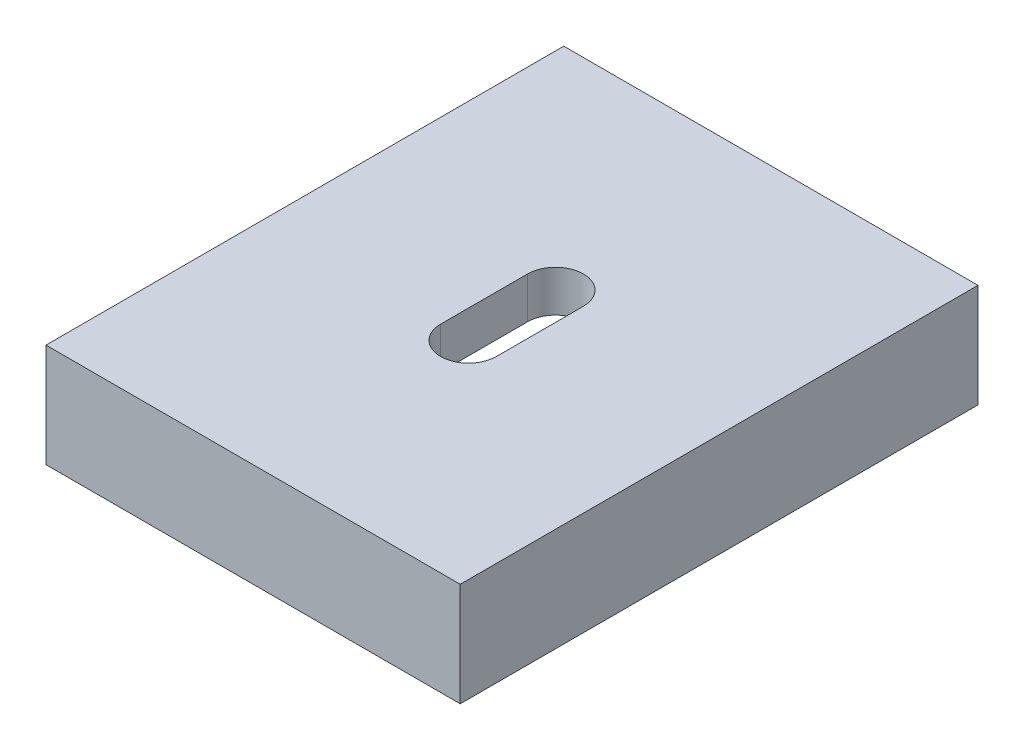
ISO-10303-21;
HEADER;
FILE_DESCRIPTION(('STEP AP214'),'2;1');
FILE_NAME('part.step','',(''),(''),'','','');
FILE_SCHEMA(('AUTOMOTIVE_DESIGN { 1 0 10303 214 1 1 1 1 }'));
ENDSEC;
DATA;
#1=APPLICATION_CONTEXT('core data for automotive mechanical design processes');
#2=APPLICATION_PROTOCOL_DEFINITION('international standard','automotive_design',2000,#1);
#3=PRODUCT_CONTEXT('',#1,'mechanical');
#4=PRODUCT('Part','Part','',(#3));
#5=PRODUCT_RELATED_PRODUCT_CATEGORY('part','',(#4));
#6=PRODUCT_DEFINITION_FORMATION('','',#4);
#7=PRODUCT_DEFINITION_CONTEXT('part definition',#1,'design');
#8=PRODUCT_DEFINITION('design','',#6,#7);
#9=PRODUCT_DEFINITION_SHAPE('','',#8);
#10=(LENGTH_UNIT() NAMED_UNIT(*) SI_UNIT(.MILLI.,.METRE.));
#11=(NAMED_UNIT(*) PLANE_ANGLE_UNIT() SI_UNIT($,.RADIAN.));
#12=(NAMED_UNIT(*) SI_UNIT($,.STERADIAN.) SOLID_ANGLE_UNIT());
#13=UNCERTAINTY_MEASURE_WITH_UNIT(LENGTH_MEASURE(1.E-05),#10,'distance_accuracy_value','');
#14=(GEOMETRIC_REPRESENTATION_CONTEXT(3) GLOBAL_UNCERTAINTY_ASSIGNED_CONTEXT((#13)) GLOBAL_UNIT_ASSIGNED_CONTEXT((#10,
#11,#12)) REPRESENTATION_CONTEXT('',''));
#15=CARTESIAN_POINT('',(0.,0.,0.));
#16=DIRECTION('',(0.,0.,1.));
#17=DIRECTION('',(1.,0.,0.));
#18=AXIS2_PLACEMENT_3D('',#15,#16,#17);
#19=CARTESIAN_POINT('',(0.,10.,0.));
#20=DIRECTION('',(0.,1.,0.));
#21=DIRECTION('',(0.,0.,1.));
#22=AXIS2_PLACEMENT_3D('',#19,#20,#21);
#23=PLANE('',#22);
#24=DIRECTION('',(1.,0.,0.));
#25=VECTOR('',#24,1.);
#26=CARTESIAN_POINT('',(-20.,10.,25.));
#27=LINE('',#26,#25);
#28=CARTESIAN_POINT('',(-20.,10.,25.));
#29=VERTEX_POINT('',#28);
#30=CARTESIAN_POINT('',(20.,10.,25.));
#31=VERTEX_POINT('',#30);
#32=EDGE_CURVE('E192',#29,#31,#27,.T.);
#33=ORIENTED_EDGE('',*,*,#32,.T.);
#34=DIRECTION('',(0.,0.,-1.));
#35=VECTOR('',#34,1.);
#36=CARTESIAN_POINT('',(20.,10.,25.));
#37=LINE('',#36,#35);
#38=CARTESIAN_POINT('',(20.,10.,-25.));
#39=VERTEX_POINT('',#38);
#40=EDGE_CURVE('E195',#31,#39,#37,.T.);
#41=ORIENTED_EDGE('',*,*,#40,.T.);
#42=DIRECTION('',(-1.,0.,0.));
#43=VECTOR('',#42,1.);
#44=CARTESIAN_POINT('',(-20.,10.,-25.));
#45=LINE('',#44,#43);
#46=CARTESIAN_POINT('',(-20.,10.,-25.));
#47=VERTEX_POINT('',#46);
#48=EDGE_CURVE('E198',#39,#47,#45,.T.);
#49=ORIENTED_EDGE('',*,*,#48,.T.);
#50=DIRECTION('',(0.,0.,1.));
#51=VECTOR('',#50,1.);
#52=CARTESIAN_POINT('',(-20.,10.,25.));
#53=LINE('',#52,#51);
#54=EDGE_CURVE('E200',#47,#29,#53,.T.);
#55=ORIENTED_EDGE('',*,*,#54,.T.);
#56=EDGE_LOOP('',(#33,#41,#49,#55));
#57=FACE_BOUND('',#56,.T.);
#58=DIRECTION('',(0.,0.,1.));
#59=VECTOR('',#58,1.);
#60=CARTESIAN_POINT('',(-2.7,10.,0.));
#61=LINE('',#60,#59);
#62=CARTESIAN_POINT('',(-2.7,10.,-4.2));
#63=VERTEX_POINT('',#62);
#64=CARTESIAN_POINT('',(-2.7,10.,4.2));
#65=VERTEX_POINT('',#64);
#66=EDGE_CURVE('E136',#63,#65,#61,.T.);
#67=ORIENTED_EDGE('',*,*,#66,.F.);
#68=CARTESIAN_POINT('',(0.,10.,-4.2));
#69=DIRECTION('',(0.,-1.,0.));
#70=DIRECTION('',(1.,0.,0.));
#71=AXIS2_PLACEMENT_3D('',#68,#69,#70);
#72=CIRCLE('',#71,2.7);
#73=CARTESIAN_POINT('',(2.7,10.,-4.2));
#74=VERTEX_POINT('',#73);
#75=EDGE_CURVE('E128',#74,#63,#72,.F.);
#76=ORIENTED_EDGE('',*,*,#75,.F.);
#77=DIRECTION('',(0.,0.,1.));
#78=VECTOR('',#77,1.);
#79=CARTESIAN_POINT('',(2.7,10.,0.));
#80=LINE('',#79,#78);
#81=CARTESIAN_POINT('',(2.7,10.,4.2));
#82=VERTEX_POINT('',#81);
#83=EDGE_CURVE('E139',#74,#82,#80,.T.);
#84=ORIENTED_EDGE('',*,*,#83,.T.);
#85=CARTESIAN_POINT('',(0.,10.,4.2));
#86=DIRECTION('',(0.,-1.,0.));
#87=DIRECTION('',(1.,0.,0.));
#88=AXIS2_PLACEMENT_3D('',#85,#86,#87);
#89=CIRCLE('',#88,2.7);
#90=EDGE_CURVE('E55',#82,#65,#89,.T.);
#91=ORIENTED_EDGE('',*,*,#90,.T.);
#92=EDGE_LOOP('',(#67,#76,#84,#91));
#93=FACE_BOUND('',#92,.T.);
#94=ADVANCED_FACE('F35',(#57,#93),#23,.T.);
#95=CARTESIAN_POINT('',(0.,0.,0.));
#96=DIRECTION('',(0.,1.,0.));
#97=DIRECTION('',(0.,0.,1.));
#98=AXIS2_PLACEMENT_3D('',#95,#96,#97);
#99=PLANE('',#98);
#100=DIRECTION('',(1.,0.,0.));
#101=VECTOR('',#100,1.);
#102=CARTESIAN_POINT('',(-20.,0.,25.));
#103=LINE('',#102,#101);
#104=CARTESIAN_POINT('',(-20.,0.,25.));
#105=VERTEX_POINT('',#104);
#106=CARTESIAN_POINT('',(20.,0.,25.));
#107=VERTEX_POINT('',#106);
#108=EDGE_CURVE('E191',#105,#107,#103,.T.);
#109=ORIENTED_EDGE('',*,*,#108,.F.);
#110=DIRECTION('',(0.,0.,1.));
#111=VECTOR('',#110,1.);
#112=CARTESIAN_POINT('',(-20.,0.,25.));
#113=LINE('',#112,#111);
#114=CARTESIAN_POINT('',(-20.,0.,-25.));
#115=VERTEX_POINT('',#114);
#116=EDGE_CURVE('E196',#115,#105,#113,.T.);
#117=ORIENTED_EDGE('',*,*,#116,.F.);
#118=DIRECTION('',(-1.,0.,0.));
#119=VECTOR('',#118,1.);
#120=CARTESIAN_POINT('',(-20.,0.,-25.));
#121=LINE('',#120,#119);
#122=CARTESIAN_POINT('',(20.,0.,-25.));
#123=VERTEX_POINT('',#122);
#124=EDGE_CURVE('E207',#123,#115,#121,.T.);
#125=ORIENTED_EDGE('',*,*,#124,.F.);
#126=DIRECTION('',(0.,0.,-1.));
#127=VECTOR('',#126,1.);
#128=CARTESIAN_POINT('',(20.,0.,25.));
#129=LINE('',#128,#127);
#130=EDGE_CURVE('E205',#107,#123,#129,.T.);
#131=ORIENTED_EDGE('',*,*,#130,.F.);
#132=EDGE_LOOP('',(#109,#117,#125,#131));
#133=FACE_BOUND('',#132,.T.);
#134=DIRECTION('',(0.,0.,-1.));
#135=VECTOR('',#134,1.);
#136=CARTESIAN_POINT('',(13.,0.,0.));
#137=LINE('',#136,#135);
#138=CARTESIAN_POINT('',(13.,0.,20.5));
#139=VERTEX_POINT('',#138);
#140=CARTESIAN_POINT('',(13.,0.,-20.5));
#141=VERTEX_POINT('',#140);
#142=EDGE_CURVE('E157',#139,#141,#137,.T.);
#143=ORIENTED_EDGE('',*,*,#142,.T.);
#144=DIRECTION('',(-1.,0.,0.));
#145=VECTOR('',#144,1.);
#146=CARTESIAN_POINT('',(0.,0.,-20.5));
#147=LINE('',#146,#145);
#148=CARTESIAN_POINT('',(-13.,0.,-20.5));
#149=VERTEX_POINT('',#148);
#150=EDGE_CURVE('E174',#141,#149,#147,.T.);
#151=ORIENTED_EDGE('',*,*,#150,.T.);
#152=DIRECTION('',(0.,0.,1.));
#153=VECTOR('',#152,1.);
#154=CARTESIAN_POINT('',(-13.,0.,0.));
#155=LINE('',#154,#153);
#156=CARTESIAN_POINT('',(-13.,0.,20.5));
#157=VERTEX_POINT('',#156);
#158=EDGE_CURVE('E177',#149,#157,#155,.T.);
#159=ORIENTED_EDGE('',*,*,#158,.T.);
#160=DIRECTION('',(1.,0.,0.));
#161=VECTOR('',#160,1.);
#162=CARTESIAN_POINT('',(0.,0.,20.5));
#163=LINE('',#162,#161);
#164=EDGE_CURVE('E165',#157,#139,#163,.T.);
#165=ORIENTED_EDGE('',*,*,#164,.T.);
#166=EDGE_LOOP('',(#143,#151,#159,#165));
#167=FACE_BOUND('',#166,.T.);
#168=ADVANCED_FACE('F225',(#133,#167),#99,.F.);
#169=CARTESIAN_POINT('',(-20.,10.,25.));
#170=DIRECTION('',(0.,0.,-1.));
#171=DIRECTION('',(-1.,0.,0.));
#172=AXIS2_PLACEMENT_3D('',#169,#170,#171);
#173=PLANE('',#172);
#174=ORIENTED_EDGE('',*,*,#108,.T.);
#175=DIRECTION('',(0.,-1.,0.));
#176=VECTOR('',#175,1.);
#177=CARTESIAN_POINT('',(20.,10.,25.));
#178=LINE('',#177,#176);
#179=EDGE_CURVE('E11',#31,#107,#178,.T.);
#180=ORIENTED_EDGE('',*,*,#179,.F.);
#181=ORIENTED_EDGE('',*,*,#32,.F.);
#182=DIRECTION('',(0.,-1.,0.));
#183=VECTOR('',#182,1.);
#184=CARTESIAN_POINT('',(-20.,10.,25.));
#185=LINE('',#184,#183);
#186=EDGE_CURVE('E202',#29,#105,#185,.T.);
#187=ORIENTED_EDGE('',*,*,#186,.T.);
#188=EDGE_LOOP('',(#174,#180,#181,#187));
#189=FACE_BOUND('',#188,.T.);
#190=ADVANCED_FACE('F37',(#189),#173,.F.);
#191=CARTESIAN_POINT('',(20.,10.,25.));
#192=DIRECTION('',(-1.,0.,0.));
#193=DIRECTION('',(0.,0.,1.));
#194=AXIS2_PLACEMENT_3D('',#191,#192,#193);
#195=PLANE('',#194);
#196=ORIENTED_EDGE('',*,*,#130,.T.);
#197=DIRECTION('',(0.,-1.,0.));
#198=VECTOR('',#197,1.);
#199=CARTESIAN_POINT('',(20.,10.,-25.));
#200=LINE('',#199,#198);
#201=EDGE_CURVE('E43',#39,#123,#200,.T.);
#202=ORIENTED_EDGE('',*,*,#201,.F.);
#203=ORIENTED_EDGE('',*,*,#40,.F.);
#204=ORIENTED_EDGE('',*,*,#179,.T.);
#205=EDGE_LOOP('',(#196,#202,#203,#204));
#206=FACE_BOUND('',#205,.T.);
#207=ADVANCED_FACE('F235',(#206),#195,.F.);
#208=CARTESIAN_POINT('',(-20.,10.,-25.));
#209=DIRECTION('',(0.,0.,1.));
#210=DIRECTION('',(1.,0.,0.));
#211=AXIS2_PLACEMENT_3D('',#208,#209,#210);
#212=PLANE('',#211);
#213=ORIENTED_EDGE('',*,*,#124,.T.);
#214=DIRECTION('',(0.,-1.,0.));
#215=VECTOR('',#214,1.);
#216=CARTESIAN_POINT('',(-20.,10.,-25.));
#217=LINE('',#216,#215);
#218=EDGE_CURVE('E212',#47,#115,#217,.T.);
#219=ORIENTED_EDGE('',*,*,#218,.F.);
#220=ORIENTED_EDGE('',*,*,#48,.F.);
#221=ORIENTED_EDGE('',*,*,#201,.T.);
#222=EDGE_LOOP('',(#213,#219,#220,#221));
#223=FACE_BOUND('',#222,.T.);
#224=ADVANCED_FACE('F219',(#223),#212,.F.);
#225=CARTESIAN_POINT('',(-20.,10.,25.));
#226=DIRECTION('',(1.,0.,0.));
#227=DIRECTION('',(0.,0.,-1.));
#228=AXIS2_PLACEMENT_3D('',#225,#226,#227);
#229=PLANE('',#228);
#230=ORIENTED_EDGE('',*,*,#116,.T.);
#231=ORIENTED_EDGE('',*,*,#186,.F.);
#232=ORIENTED_EDGE('',*,*,#54,.F.);
#233=ORIENTED_EDGE('',*,*,#218,.T.);
#234=EDGE_LOOP('',(#230,#231,#232,#233));
#235=FACE_BOUND('',#234,.T.);
#236=ADVANCED_FACE('F229',(#235),#229,.F.);
#237=CARTESIAN_POINT('',(13.,6.,0.));
#238=DIRECTION('',(-1.,0.,0.));
#239=DIRECTION('',(0.,-1.,0.));
#240=AXIS2_PLACEMENT_3D('',#237,#238,#239);
#241=PLANE('',#240);
#242=ORIENTED_EDGE('',*,*,#142,.F.);
#243=DIRECTION('',(0.,-1.,0.));
#244=VECTOR('',#243,1.);
#245=CARTESIAN_POINT('',(13.,6.,20.5));
#246=LINE('',#245,#244);
#247=CARTESIAN_POINT('',(13.,6.,20.5));
#248=VERTEX_POINT('',#247);
#249=EDGE_CURVE('E171',#248,#139,#246,.T.);
#250=ORIENTED_EDGE('',*,*,#249,.F.);
#251=DIRECTION('',(0.,0.,-1.));
#252=VECTOR('',#251,1.);
#253=CARTESIAN_POINT('',(13.,6.,0.));
#254=LINE('',#253,#252);
#255=CARTESIAN_POINT('',(13.,6.,-20.5));
#256=VERTEX_POINT('',#255);
#257=EDGE_CURVE('E161',#248,#256,#254,.T.);
#258=ORIENTED_EDGE('',*,*,#257,.T.);
#259=DIRECTION('',(0.,-1.,0.));
#260=VECTOR('',#259,1.);
#261=CARTESIAN_POINT('',(13.,6.,-20.5));
#262=LINE('',#261,#260);
#263=EDGE_CURVE('E188',#256,#141,#262,.T.);
#264=ORIENTED_EDGE('',*,*,#263,.T.);
#265=EDGE_LOOP('',(#242,#250,#258,#264));
#266=FACE_BOUND('',#265,.T.);
#267=ADVANCED_FACE('F249',(#266),#241,.T.);
#268=CARTESIAN_POINT('',(0.,6.,-20.5));
#269=DIRECTION('',(0.,0.,1.));
#270=DIRECTION('',(1.,0.,0.));
#271=AXIS2_PLACEMENT_3D('',#268,#269,#270);
#272=PLANE('',#271);
#273=ORIENTED_EDGE('',*,*,#150,.F.);
#274=ORIENTED_EDGE('',*,*,#263,.F.);
#275=DIRECTION('',(-1.,0.,0.));
#276=VECTOR('',#275,1.);
#277=CARTESIAN_POINT('',(0.,6.,-20.5));
#278=LINE('',#277,#276);
#279=CARTESIAN_POINT('',(-13.,6.,-20.5));
#280=VERTEX_POINT('',#279);
#281=EDGE_CURVE('E164',#256,#280,#278,.T.);
#282=ORIENTED_EDGE('',*,*,#281,.T.);
#283=DIRECTION('',(0.,-1.,0.));
#284=VECTOR('',#283,1.);
#285=CARTESIAN_POINT('',(-13.,6.,-20.5));
#286=LINE('',#285,#284);
#287=EDGE_CURVE('E186',#280,#149,#286,.T.);
#288=ORIENTED_EDGE('',*,*,#287,.T.);
#289=EDGE_LOOP('',(#273,#274,#282,#288));
#290=FACE_BOUND('',#289,.T.);
#291=ADVANCED_FACE('F256',(#290),#272,.T.);
#292=CARTESIAN_POINT('',(-13.,6.,0.));
#293=DIRECTION('',(1.,0.,0.));
#294=DIRECTION('',(0.,1.,0.));
#295=AXIS2_PLACEMENT_3D('',#292,#293,#294);
#296=PLANE('',#295);
#297=ORIENTED_EDGE('',*,*,#158,.F.);
#298=ORIENTED_EDGE('',*,*,#287,.F.);
#299=DIRECTION('',(0.,0.,1.));
#300=VECTOR('',#299,1.);
#301=CARTESIAN_POINT('',(-13.,6.,0.));
#302=LINE('',#301,#300);
#303=CARTESIAN_POINT('',(-13.,6.,20.5));
#304=VERTEX_POINT('',#303);
#305=EDGE_CURVE('E167',#280,#304,#302,.T.);
#306=ORIENTED_EDGE('',*,*,#305,.T.);
#307=DIRECTION('',(0.,-1.,0.));
#308=VECTOR('',#307,1.);
#309=CARTESIAN_POINT('',(-13.,6.,20.5));
#310=LINE('',#309,#308);
#311=EDGE_CURVE('E184',#304,#157,#310,.T.);
#312=ORIENTED_EDGE('',*,*,#311,.T.);
#313=EDGE_LOOP('',(#297,#298,#306,#312));
#314=FACE_BOUND('',#313,.T.);
#315=ADVANCED_FACE('F261',(#314),#296,.T.);
#316=CARTESIAN_POINT('',(0.,6.,20.5));
#317=DIRECTION('',(0.,0.,-1.));
#318=DIRECTION('',(-1.,0.,0.));
#319=AXIS2_PLACEMENT_3D('',#316,#317,#318);
#320=PLANE('',#319);
#321=ORIENTED_EDGE('',*,*,#164,.F.);
#322=ORIENTED_EDGE('',*,*,#311,.F.);
#323=DIRECTION('',(1.,0.,0.));
#324=VECTOR('',#323,1.);
#325=CARTESIAN_POINT('',(0.,6.,20.5));
#326=LINE('',#325,#324);
#327=EDGE_CURVE('E169',#304,#248,#326,.T.);
#328=ORIENTED_EDGE('',*,*,#327,.T.);
#329=ORIENTED_EDGE('',*,*,#249,.T.);
#330=EDGE_LOOP('',(#321,#322,#328,#329));
#331=FACE_BOUND('',#330,.T.);
#332=ADVANCED_FACE('F268',(#331),#320,.T.);
#333=CARTESIAN_POINT('',(0.,6.,0.));
#334=DIRECTION('',(0.,1.,0.));
#335=DIRECTION('',(0.,0.,1.));
#336=AXIS2_PLACEMENT_3D('',#333,#334,#335);
#337=PLANE('',#336);
#338=DIRECTION('',(0.,0.,1.));
#339=VECTOR('',#338,1.);
#340=CARTESIAN_POINT('',(2.7,6.,0.));
#341=LINE('',#340,#339);
#342=CARTESIAN_POINT('',(2.7,6.,-4.2));
#343=VERTEX_POINT('',#342);
#344=CARTESIAN_POINT('',(2.7,6.,4.2));
#345=VERTEX_POINT('',#344);
#346=EDGE_CURVE('E152',#343,#345,#341,.T.);
#347=ORIENTED_EDGE('',*,*,#346,.F.);
#348=CARTESIAN_POINT('',(0.,6.,-4.2));
#349=DIRECTION('',(0.,-1.,0.));
#350=DIRECTION('',(1.,0.,0.));
#351=AXIS2_PLACEMENT_3D('',#348,#349,#350);
#352=CIRCLE('',#351,2.7);
#353=CARTESIAN_POINT('',(-2.7,6.,-4.2));
#354=VERTEX_POINT('',#353);
#355=EDGE_CURVE('E131',#343,#354,#352,.F.);
#356=ORIENTED_EDGE('',*,*,#355,.T.);
#357=DIRECTION('',(0.,0.,1.));
#358=VECTOR('',#357,1.);
#359=CARTESIAN_POINT('',(-2.7,6.,0.));
#360=LINE('',#359,#358);
#361=CARTESIAN_POINT('',(-2.7,6.,4.2));
#362=VERTEX_POINT('',#361);
#363=EDGE_CURVE('E144',#354,#362,#360,.T.);
#364=ORIENTED_EDGE('',*,*,#363,.T.);
#365=CARTESIAN_POINT('',(0.,6.,4.2));
#366=DIRECTION('',(0.,-1.,0.));
#367=DIRECTION('',(1.,0.,0.));
#368=AXIS2_PLACEMENT_3D('',#365,#366,#367);
#369=CIRCLE('',#368,2.7);
#370=EDGE_CURVE('E50',#345,#362,#369,.T.);
#371=ORIENTED_EDGE('',*,*,#370,.F.);
#372=EDGE_LOOP('',(#347,#356,#364,#371));
#373=FACE_BOUND('',#372,.T.);
#374=ORIENTED_EDGE('',*,*,#257,.F.);
#375=ORIENTED_EDGE('',*,*,#327,.F.);
#376=ORIENTED_EDGE('',*,*,#305,.F.);
#377=ORIENTED_EDGE('',*,*,#281,.F.);
#378=EDGE_LOOP('',(#374,#375,#376,#377));
#379=FACE_BOUND('',#378,.T.);
#380=ADVANCED_FACE('F276',(#373,#379),#337,.F.);
#381=CARTESIAN_POINT('',(0.,10.,-4.2));
#382=DIRECTION('',(0.,-1.,0.));
#383=DIRECTION('',(1.,0.,0.));
#384=AXIS2_PLACEMENT_3D('',#381,#382,#383);
#385=CYLINDRICAL_SURFACE('',#384,2.7);
#386=ORIENTED_EDGE('',*,*,#355,.F.);
#387=DIRECTION('',(0.,-1.,0.));
#388=VECTOR('',#387,1.);
#389=CARTESIAN_POINT('',(2.7,10.,-4.2));
#390=LINE('',#389,#388);
#391=EDGE_CURVE('E123',#74,#343,#390,.T.);
#392=ORIENTED_EDGE('',*,*,#391,.F.);
#393=ORIENTED_EDGE('',*,*,#75,.T.);
#394=DIRECTION('',(0.,-1.,0.));
#395=VECTOR('',#394,1.);
#396=CARTESIAN_POINT('',(-2.7,10.,-4.2));
#397=LINE('',#396,#395);
#398=EDGE_CURVE('E155',#63,#354,#397,.T.);
#399=ORIENTED_EDGE('',*,*,#398,.T.);
#400=EDGE_LOOP('',(#386,#392,#393,#399));
#401=FACE_BOUND('',#400,.T.);
#402=ADVANCED_FACE('F125',(#401),#385,.F.);
#403=CARTESIAN_POINT('',(-2.7,10.,0.));
#404=DIRECTION('',(1.,0.,0.));
#405=DIRECTION('',(0.,0.,-1.));
#406=AXIS2_PLACEMENT_3D('',#403,#404,#405);
#407=PLANE('',#406);
#408=ORIENTED_EDGE('',*,*,#363,.F.);
#409=ORIENTED_EDGE('',*,*,#398,.F.);
#410=ORIENTED_EDGE('',*,*,#66,.T.);
#411=DIRECTION('',(0.,-1.,0.));
#412=VECTOR('',#411,1.);
#413=CARTESIAN_POINT('',(-2.7,10.,4.2));
#414=LINE('',#413,#412);
#415=EDGE_CURVE('E158',#65,#362,#414,.T.);
#416=ORIENTED_EDGE('',*,*,#415,.T.);
#417=EDGE_LOOP('',(#408,#409,#410,#416));
#418=FACE_BOUND('',#417,.T.);
#419=ADVANCED_FACE('F284',(#418),#407,.T.);
#420=CARTESIAN_POINT('',(0.,10.,4.2));
#421=DIRECTION('',(0.,-1.,0.));
#422=DIRECTION('',(1.,0.,0.));
#423=AXIS2_PLACEMENT_3D('',#420,#421,#422);
#424=CYLINDRICAL_SURFACE('',#423,2.7);
#425=ORIENTED_EDGE('',*,*,#370,.T.);
#426=ORIENTED_EDGE('',*,*,#415,.F.);
#427=ORIENTED_EDGE('',*,*,#90,.F.);
#428=DIRECTION('',(0.,-1.,0.));
#429=VECTOR('',#428,1.);
#430=CARTESIAN_POINT('',(2.7,10.,4.2));
#431=LINE('',#430,#429);
#432=EDGE_CURVE('E135',#82,#345,#431,.T.);
#433=ORIENTED_EDGE('',*,*,#432,.T.);
#434=EDGE_LOOP('',(#425,#426,#427,#433));
#435=FACE_BOUND('',#434,.T.);
#436=ADVANCED_FACE('F321',(#435),#424,.F.);
#437=CARTESIAN_POINT('',(2.7,10.,0.));
#438=DIRECTION('',(1.,0.,0.));
#439=DIRECTION('',(0.,1.,0.));
#440=AXIS2_PLACEMENT_3D('',#437,#438,#439);
#441=PLANE('',#440);
#442=ORIENTED_EDGE('',*,*,#346,.T.);
#443=ORIENTED_EDGE('',*,*,#432,.F.);
#444=ORIENTED_EDGE('',*,*,#83,.F.);
#445=ORIENTED_EDGE('',*,*,#391,.T.);
#446=EDGE_LOOP('',(#442,#443,#444,#445));
#447=FACE_BOUND('',#446,.T.);
#448=ADVANCED_FACE('F140',(#447),#441,.F.);
#449=CLOSED_SHELL('',(#94,#168,#190,#207,#224,#236,#267,#291,#315,#332,#380,#402,#419,#436,#448));
#450=MANIFOLD_SOLID_BREP('B2',#449);
#451=ADVANCED_BREP_SHAPE_REPRESENTATION('',(#18,#450),#14);
#452=SHAPE_DEFINITION_REPRESENTATION(#9,#451);
ENDSEC;
END-ISO-10303-21;
